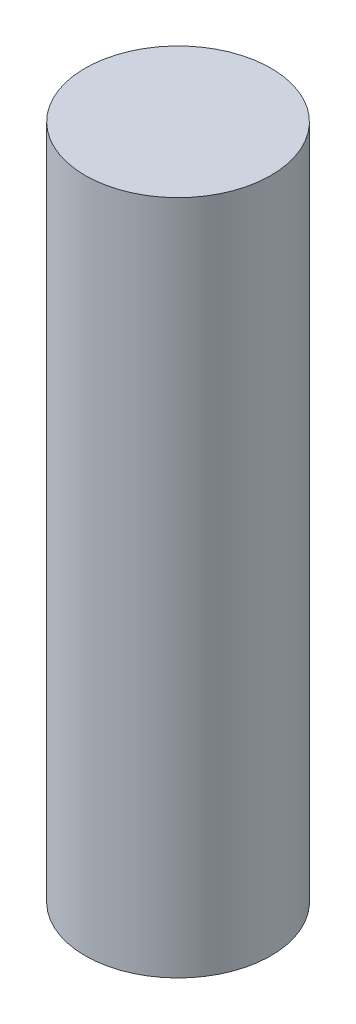
ISO-10303-21;
HEADER;
FILE_DESCRIPTION(('STEP AP214'),'2;1');
FILE_NAME('part.step','',(''),(''),'','','');
FILE_SCHEMA(('AUTOMOTIVE_DESIGN { 1 0 10303 214 1 1 1 1 }'));
ENDSEC;
DATA;
#1=APPLICATION_CONTEXT('core data for automotive mechanical design processes');
#2=APPLICATION_PROTOCOL_DEFINITION('international standard','automotive_design',2000,#1);
#3=PRODUCT_CONTEXT('',#1,'mechanical');
#4=PRODUCT('Part','Part','',(#3));
#5=PRODUCT_RELATED_PRODUCT_CATEGORY('part','',(#4));
#6=PRODUCT_DEFINITION_FORMATION('','',#4);
#7=PRODUCT_DEFINITION_CONTEXT('part definition',#1,'design');
#8=PRODUCT_DEFINITION('design','',#6,#7);
#9=PRODUCT_DEFINITION_SHAPE('','',#8);
#10=(LENGTH_UNIT() NAMED_UNIT(*) SI_UNIT(.MILLI.,.METRE.));
#11=(NAMED_UNIT(*) PLANE_ANGLE_UNIT() SI_UNIT($,.RADIAN.));
#12=(NAMED_UNIT(*) SI_UNIT($,.STERADIAN.) SOLID_ANGLE_UNIT());
#13=UNCERTAINTY_MEASURE_WITH_UNIT(LENGTH_MEASURE(1.E-05),#10,'distance_accuracy_value','');
#14=(GEOMETRIC_REPRESENTATION_CONTEXT(3) GLOBAL_UNCERTAINTY_ASSIGNED_CONTEXT((#13)) GLOBAL_UNIT_ASSIGNED_CONTEXT((#10,
#11,#12)) REPRESENTATION_CONTEXT('',''));
#15=CARTESIAN_POINT('',(0.,0.,0.));
#16=DIRECTION('',(0.,0.,1.));
#17=DIRECTION('',(1.,0.,0.));
#18=AXIS2_PLACEMENT_3D('',#15,#16,#17);
#19=CARTESIAN_POINT('',(0.,100.,0.));
#20=DIRECTION('',(0.,-1.,0.));
#21=DIRECTION('',(0.,0.,-1.));
#22=AXIS2_PLACEMENT_3D('',#19,#20,#21);
#23=CYLINDRICAL_SURFACE('',#22,13.75);
#24=CARTESIAN_POINT('',(0.,100.,0.));
#25=DIRECTION('',(0.,1.,0.));
#26=DIRECTION('',(0.,0.,1.));
#27=AXIS2_PLACEMENT_3D('',#24,#25,#26);
#28=CIRCLE('',#27,13.75);
#29=CARTESIAN_POINT('',(0.,100.,13.75));
#30=VERTEX_POINT('',#29);
#31=EDGE_CURVE('E10',#30,#30,#28,.T.);
#32=ORIENTED_EDGE('',*,*,#31,.F.);
#33=EDGE_LOOP('',(#32));
#34=FACE_BOUND('',#33,.T.);
#35=CARTESIAN_POINT('',(0.,0.,0.));
#36=DIRECTION('',(0.,1.,0.));
#37=DIRECTION('',(0.,0.,1.));
#38=AXIS2_PLACEMENT_3D('',#35,#36,#37);
#39=CIRCLE('',#38,13.75);
#40=CARTESIAN_POINT('',(0.,0.,13.75));
#41=VERTEX_POINT('',#40);
#42=EDGE_CURVE('E34',#41,#41,#39,.T.);
#43=ORIENTED_EDGE('',*,*,#42,.T.);
#44=EDGE_LOOP('',(#43));
#45=FACE_BOUND('',#44,.T.);
#46=ADVANCED_FACE('F31',(#34,#45),#23,.T.);
#47=CARTESIAN_POINT('',(0.,100.,0.));
#48=DIRECTION('',(0.,1.,0.));
#49=DIRECTION('',(0.,0.,1.));
#50=AXIS2_PLACEMENT_3D('',#47,#48,#49);
#51=PLANE('',#50);
#52=ORIENTED_EDGE('',*,*,#31,.T.);
#53=EDGE_LOOP('',(#52));
#54=FACE_BOUND('',#53,.T.);
#55=ADVANCED_FACE('F46',(#54),#51,.T.);
#56=CARTESIAN_POINT('',(0.,0.,0.));
#57=DIRECTION('',(0.,1.,0.));
#58=DIRECTION('',(0.,0.,1.));
#59=AXIS2_PLACEMENT_3D('',#56,#57,#58);
#60=PLANE('',#59);
#61=ORIENTED_EDGE('',*,*,#42,.F.);
#62=EDGE_LOOP('',(#61));
#63=FACE_BOUND('',#62,.T.);
#64=ADVANCED_FACE('F44',(#63),#60,.F.);
#65=CLOSED_SHELL('',(#46,#55,#64));
#66=MANIFOLD_SOLID_BREP('B2',#65);
#67=ADVANCED_BREP_SHAPE_REPRESENTATION('',(#18,#66),#14);
#68=SHAPE_DEFINITION_REPRESENTATION(#9,#67);
ENDSEC;
END-ISO-10303-21;
